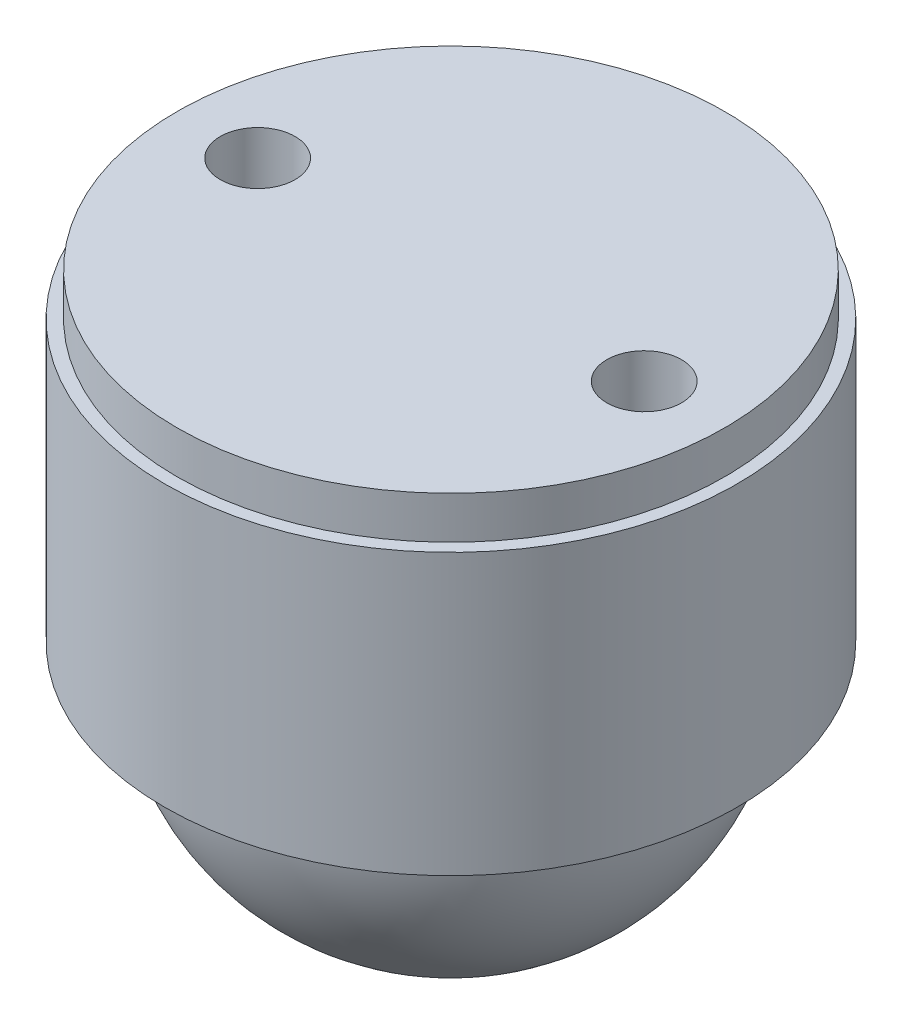
ISO-10303-21;
HEADER;
FILE_DESCRIPTION(('STEP AP214'),'2;1');
FILE_NAME('part.step','',(''),(''),'','','');
FILE_SCHEMA(('AUTOMOTIVE_DESIGN { 1 0 10303 214 1 1 1 1 }'));
ENDSEC;
DATA;
#1=APPLICATION_CONTEXT('core data for automotive mechanical design processes');
#2=APPLICATION_PROTOCOL_DEFINITION('international standard','automotive_design',2000,#1);
#3=PRODUCT_CONTEXT('',#1,'mechanical');
#4=PRODUCT('Part','Part','',(#3));
#5=PRODUCT_RELATED_PRODUCT_CATEGORY('part','',(#4));
#6=PRODUCT_DEFINITION_FORMATION('','',#4);
#7=PRODUCT_DEFINITION_CONTEXT('part definition',#1,'design');
#8=PRODUCT_DEFINITION('design','',#6,#7);
#9=PRODUCT_DEFINITION_SHAPE('','',#8);
#10=(LENGTH_UNIT() NAMED_UNIT(*) SI_UNIT(.MILLI.,.METRE.));
#11=(NAMED_UNIT(*) PLANE_ANGLE_UNIT() SI_UNIT($,.RADIAN.));
#12=(NAMED_UNIT(*) SI_UNIT($,.STERADIAN.) SOLID_ANGLE_UNIT());
#13=UNCERTAINTY_MEASURE_WITH_UNIT(LENGTH_MEASURE(1.E-05),#10,'distance_accuracy_value','');
#14=(GEOMETRIC_REPRESENTATION_CONTEXT(3) GLOBAL_UNCERTAINTY_ASSIGNED_CONTEXT((#13)) GLOBAL_UNIT_ASSIGNED_CONTEXT((#10,
#11,#12)) REPRESENTATION_CONTEXT('',''));
#15=CARTESIAN_POINT('',(0.,0.,0.));
#16=DIRECTION('',(0.,0.,1.));
#17=DIRECTION('',(1.,0.,0.));
#18=AXIS2_PLACEMENT_3D('',#15,#16,#17);
#19=CARTESIAN_POINT('',(0.,0.,0.));
#20=DIRECTION('',(0.,0.,-1.));
#21=DIRECTION('',(1.,0.,0.));
#22=AXIS2_PLACEMENT_3D('',#19,#20,#21);
#23=SPHERICAL_SURFACE('',#22,9.525);
#24=CARTESIAN_POINT('',(0.,0.,0.));
#25=DIRECTION('',(0.,1.,0.));
#26=DIRECTION('',(0.,0.,1.));
#27=AXIS2_PLACEMENT_3D('',#24,#25,#26);
#28=SPHERICAL_SURFACE('',#27,9.525);
#29=CARTESIAN_POINT('',(0.,0.,0.));
#30=DIRECTION('',(0.,1.,0.));
#31=DIRECTION('',(0.,0.,1.));
#32=AXIS2_PLACEMENT_3D('',#29,#30,#31);
#33=CIRCLE('',#32,9.525);
#34=CARTESIAN_POINT('',(0.,0.,9.525));
#35=VERTEX_POINT('',#34);
#36=EDGE_CURVE('E33',#35,#35,#33,.T.);
#37=ORIENTED_EDGE('',*,*,#36,.F.);
#38=EDGE_LOOP('',(#37));
#39=FACE_BOUND('',#38,.T.);
#40=ADVANCED_FACE('F30',(#39),#28,.T.);
#41=CARTESIAN_POINT('',(0.,11.225,0.));
#42=DIRECTION('',(0.,-1.,0.));
#43=DIRECTION('',(0.,0.,-1.));
#44=AXIS2_PLACEMENT_3D('',#41,#42,#43);
#45=CYLINDRICAL_SURFACE('',#44,11.475);
#46=CARTESIAN_POINT('',(0.,11.225,0.));
#47=DIRECTION('',(0.,1.,0.));
#48=DIRECTION('',(0.,0.,1.));
#49=AXIS2_PLACEMENT_3D('',#46,#47,#48);
#50=CIRCLE('',#49,11.475);
#51=CARTESIAN_POINT('',(0.,11.225,11.475));
#52=VERTEX_POINT('',#51);
#53=EDGE_CURVE('E41',#52,#52,#50,.T.);
#54=ORIENTED_EDGE('',*,*,#53,.F.);
#55=EDGE_LOOP('',(#54));
#56=FACE_BOUND('',#55,.T.);
#57=CARTESIAN_POINT('',(0.,0.,0.));
#58=DIRECTION('',(0.,1.,0.));
#59=DIRECTION('',(0.,0.,1.));
#60=AXIS2_PLACEMENT_3D('',#57,#58,#59);
#61=CIRCLE('',#60,11.475);
#62=CARTESIAN_POINT('',(0.,0.,11.475));
#63=VERTEX_POINT('',#62);
#64=EDGE_CURVE('E47',#63,#63,#61,.T.);
#65=ORIENTED_EDGE('',*,*,#64,.T.);
#66=EDGE_LOOP('',(#65));
#67=FACE_BOUND('',#66,.T.);
#68=ADVANCED_FACE('F88',(#56,#67),#45,.T.);
#69=CARTESIAN_POINT('',(0.,11.225,0.));
#70=DIRECTION('',(0.,1.,0.));
#71=DIRECTION('',(0.,0.,1.));
#72=AXIS2_PLACEMENT_3D('',#69,#70,#71);
#73=PLANE('',#72);
#74=CARTESIAN_POINT('',(0.,11.225,0.));
#75=DIRECTION('',(0.,1.,0.));
#76=DIRECTION('',(0.,0.,1.));
#77=AXIS2_PLACEMENT_3D('',#74,#75,#76);
#78=CIRCLE('',#77,10.98);
#79=CARTESIAN_POINT('',(0.,11.225,10.98));
#80=VERTEX_POINT('',#79);
#81=EDGE_CURVE('E10',#80,#80,#78,.T.);
#82=ORIENTED_EDGE('',*,*,#81,.F.);
#83=EDGE_LOOP('',(#82));
#84=FACE_BOUND('',#83,.T.);
#85=ORIENTED_EDGE('',*,*,#53,.T.);
#86=EDGE_LOOP('',(#85));
#87=FACE_BOUND('',#86,.T.);
#88=ADVANCED_FACE('F93',(#84,#87),#73,.T.);
#89=CARTESIAN_POINT('',(0.,0.,0.));
#90=DIRECTION('',(0.,1.,0.));
#91=DIRECTION('',(0.,0.,1.));
#92=AXIS2_PLACEMENT_3D('',#89,#90,#91);
#93=PLANE('',#92);
#94=ORIENTED_EDGE('',*,*,#36,.T.);
#95=EDGE_LOOP('',(#94));
#96=FACE_BOUND('',#95,.T.);
#97=ORIENTED_EDGE('',*,*,#64,.F.);
#98=EDGE_LOOP('',(#97));
#99=FACE_BOUND('',#98,.T.);
#100=ADVANCED_FACE('F83',(#96,#99),#93,.F.);
#101=CARTESIAN_POINT('',(0.,12.925,0.));
#102=DIRECTION('',(0.,-1.,0.));
#103=DIRECTION('',(0.,0.,-1.));
#104=AXIS2_PLACEMENT_3D('',#101,#102,#103);
#105=CYLINDRICAL_SURFACE('',#104,10.98);
#106=CARTESIAN_POINT('',(0.,12.925,0.));
#107=DIRECTION('',(0.,1.,0.));
#108=DIRECTION('',(0.,0.,1.));
#109=AXIS2_PLACEMENT_3D('',#106,#107,#108);
#110=CIRCLE('',#109,10.98);
#111=CARTESIAN_POINT('',(0.,12.925,10.98));
#112=VERTEX_POINT('',#111);
#113=EDGE_CURVE('E44',#112,#112,#110,.T.);
#114=ORIENTED_EDGE('',*,*,#113,.F.);
#115=EDGE_LOOP('',(#114));
#116=FACE_BOUND('',#115,.T.);
#117=ORIENTED_EDGE('',*,*,#81,.T.);
#118=EDGE_LOOP('',(#117));
#119=FACE_BOUND('',#118,.T.);
#120=ADVANCED_FACE('F73',(#116,#119),#105,.T.);
#121=CARTESIAN_POINT('',(0.,12.925,0.));
#122=DIRECTION('',(0.,1.,0.));
#123=DIRECTION('',(0.,0.,1.));
#124=AXIS2_PLACEMENT_3D('',#121,#122,#123);
#125=PLANE('',#124);
#126=CARTESIAN_POINT('',(7.747,12.925,0.));
#127=DIRECTION('',(0.,1.,0.));
#128=DIRECTION('',(0.,0.,1.));
#129=AXIS2_PLACEMENT_3D('',#126,#127,#128);
#130=CIRCLE('',#129,1.5);
#131=CARTESIAN_POINT('',(7.747,12.925,1.5));
#132=VERTEX_POINT('',#131);
#133=EDGE_CURVE('E56',#132,#132,#130,.T.);
#134=ORIENTED_EDGE('',*,*,#133,.F.);
#135=EDGE_LOOP('',(#134));
#136=FACE_BOUND('',#135,.T.);
#137=CARTESIAN_POINT('',(-7.747,12.925,0.));
#138=DIRECTION('',(0.,1.,0.));
#139=DIRECTION('',(0.,0.,1.));
#140=AXIS2_PLACEMENT_3D('',#137,#138,#139);
#141=CIRCLE('',#140,1.5);
#142=CARTESIAN_POINT('',(-7.747,12.925,1.5));
#143=VERTEX_POINT('',#142);
#144=EDGE_CURVE('E65',#143,#143,#141,.T.);
#145=ORIENTED_EDGE('',*,*,#144,.F.);
#146=EDGE_LOOP('',(#145));
#147=FACE_BOUND('',#146,.T.);
#148=ORIENTED_EDGE('',*,*,#113,.T.);
#149=EDGE_LOOP('',(#148));
#150=FACE_BOUND('',#149,.T.);
#151=ADVANCED_FACE('F71',(#136,#147,#150),#125,.T.);
#152=CARTESIAN_POINT('',(-7.747,7.925,0.));
#153=DIRECTION('',(0.,1.,0.));
#154=DIRECTION('',(0.,0.,1.));
#155=AXIS2_PLACEMENT_3D('',#152,#153,#154);
#156=CYLINDRICAL_SURFACE('',#155,1.5);
#157=CARTESIAN_POINT('',(-7.747,7.925,0.));
#158=DIRECTION('',(0.,1.,0.));
#159=DIRECTION('',(0.,0.,1.));
#160=AXIS2_PLACEMENT_3D('',#157,#158,#159);
#161=CIRCLE('',#160,1.5);
#162=CARTESIAN_POINT('',(-7.747,7.925,1.5));
#163=VERTEX_POINT('',#162);
#164=EDGE_CURVE('E61',#163,#163,#161,.T.);
#165=ORIENTED_EDGE('',*,*,#164,.F.);
#166=EDGE_LOOP('',(#165));
#167=FACE_BOUND('',#166,.T.);
#168=ORIENTED_EDGE('',*,*,#144,.T.);
#169=EDGE_LOOP('',(#168));
#170=FACE_BOUND('',#169,.T.);
#171=ADVANCED_FACE('F69',(#167,#170),#156,.F.);
#172=CARTESIAN_POINT('',(-7.747,7.925,0.));
#173=DIRECTION('',(0.,1.,0.));
#174=DIRECTION('',(0.,0.,1.));
#175=AXIS2_PLACEMENT_3D('',#172,#173,#174);
#176=PLANE('',#175);
#177=ORIENTED_EDGE('',*,*,#164,.T.);
#178=EDGE_LOOP('',(#177));
#179=FACE_BOUND('',#178,.T.);
#180=ADVANCED_FACE('F80',(#179),#176,.T.);
#181=CARTESIAN_POINT('',(7.747,7.925,0.));
#182=DIRECTION('',(0.,1.,0.));
#183=DIRECTION('',(0.,0.,1.));
#184=AXIS2_PLACEMENT_3D('',#181,#182,#183);
#185=CYLINDRICAL_SURFACE('',#184,1.5);
#186=CARTESIAN_POINT('',(7.747,7.925,0.));
#187=DIRECTION('',(0.,1.,0.));
#188=DIRECTION('',(0.,0.,1.));
#189=AXIS2_PLACEMENT_3D('',#186,#187,#188);
#190=CIRCLE('',#189,1.5);
#191=CARTESIAN_POINT('',(7.747,7.925,1.5));
#192=VERTEX_POINT('',#191);
#193=EDGE_CURVE('E52',#192,#192,#190,.T.);
#194=ORIENTED_EDGE('',*,*,#193,.F.);
#195=EDGE_LOOP('',(#194));
#196=FACE_BOUND('',#195,.T.);
#197=ORIENTED_EDGE('',*,*,#133,.T.);
#198=EDGE_LOOP('',(#197));
#199=FACE_BOUND('',#198,.T.);
#200=ADVANCED_FACE('F145',(#196,#199),#185,.F.);
#201=CARTESIAN_POINT('',(7.747,7.925,0.));
#202=DIRECTION('',(0.,1.,0.));
#203=DIRECTION('',(0.,0.,1.));
#204=AXIS2_PLACEMENT_3D('',#201,#202,#203);
#205=PLANE('',#204);
#206=ORIENTED_EDGE('',*,*,#193,.T.);
#207=EDGE_LOOP('',(#206));
#208=FACE_BOUND('',#207,.T.);
#209=ADVANCED_FACE('F154',(#208),#205,.T.);
#210=CLOSED_SHELL('',(#40,#68,#88,#100,#120,#151,#171,#180,#200,#209));
#211=MANIFOLD_SOLID_BREP('B2',#210);
#212=ADVANCED_BREP_SHAPE_REPRESENTATION('',(#18,#211),#14);
#213=SHAPE_DEFINITION_REPRESENTATION(#9,#212);
ENDSEC;
END-ISO-10303-21;
